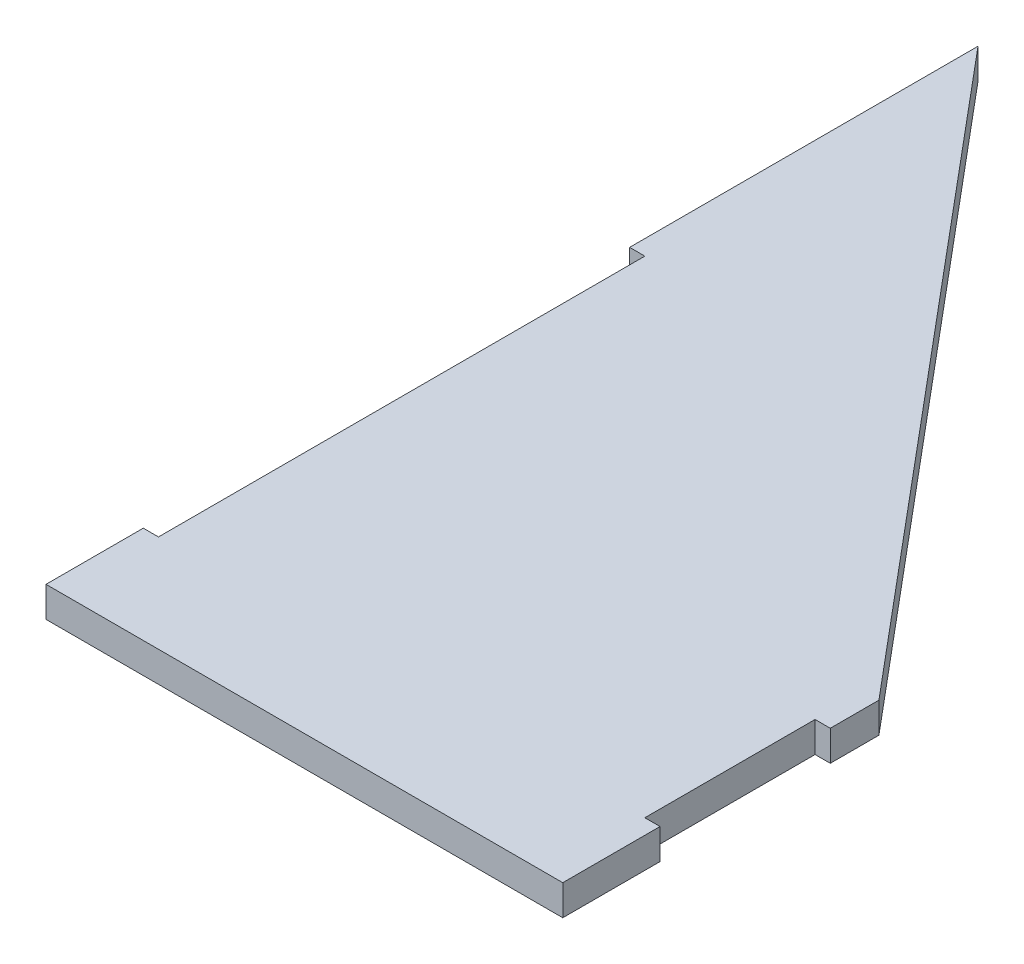
ISO-10303-21;
HEADER;
FILE_DESCRIPTION(('STEP AP214'),'2;1');
FILE_NAME('part.step','',(''),(''),'','','');
FILE_SCHEMA(('AUTOMOTIVE_DESIGN { 1 0 10303 214 1 1 1 1 }'));
ENDSEC;
DATA;
#1=APPLICATION_CONTEXT('core data for automotive mechanical design processes');
#2=APPLICATION_PROTOCOL_DEFINITION('international standard','automotive_design',2000,#1);
#3=PRODUCT_CONTEXT('',#1,'mechanical');
#4=PRODUCT('Part','Part','',(#3));
#5=PRODUCT_RELATED_PRODUCT_CATEGORY('part','',(#4));
#6=PRODUCT_DEFINITION_FORMATION('','',#4);
#7=PRODUCT_DEFINITION_CONTEXT('part definition',#1,'design');
#8=PRODUCT_DEFINITION('design','',#6,#7);
#9=PRODUCT_DEFINITION_SHAPE('','',#8);
#10=(LENGTH_UNIT() NAMED_UNIT(*) SI_UNIT(.MILLI.,.METRE.));
#11=(NAMED_UNIT(*) PLANE_ANGLE_UNIT() SI_UNIT($,.RADIAN.));
#12=(NAMED_UNIT(*) SI_UNIT($,.STERADIAN.) SOLID_ANGLE_UNIT());
#13=UNCERTAINTY_MEASURE_WITH_UNIT(LENGTH_MEASURE(1.E-05),#10,'distance_accuracy_value','');
#14=(GEOMETRIC_REPRESENTATION_CONTEXT(3) GLOBAL_UNCERTAINTY_ASSIGNED_CONTEXT((#13)) GLOBAL_UNIT_ASSIGNED_CONTEXT((#10,
#11,#12)) REPRESENTATION_CONTEXT('',''));
#15=CARTESIAN_POINT('',(0.,0.,0.));
#16=DIRECTION('',(0.,0.,1.));
#17=DIRECTION('',(1.,0.,0.));
#18=AXIS2_PLACEMENT_3D('',#15,#16,#17);
#19=CARTESIAN_POINT('',(0.,1.5875,-5.715));
#20=DIRECTION('',(0.,0.,1.));
#21=DIRECTION('',(1.,0.,0.));
#22=AXIS2_PLACEMENT_3D('',#19,#20,#21);
#23=PLANE('',#22);
#24=DIRECTION('',(-1.,0.,0.));
#25=VECTOR('',#24,1.);
#26=CARTESIAN_POINT('',(0.,0.,-5.715));
#27=LINE('',#26,#25);
#28=CARTESIAN_POINT('',(13.49375,0.,-5.715));
#29=VERTEX_POINT('',#28);
#30=CARTESIAN_POINT('',(12.7,0.,-5.715));
#31=VERTEX_POINT('',#30);
#32=EDGE_CURVE('E160',#29,#31,#27,.T.);
#33=ORIENTED_EDGE('',*,*,#32,.F.);
#34=DIRECTION('',(0.,-1.,0.));
#35=VECTOR('',#34,1.);
#36=CARTESIAN_POINT('',(13.49375,1.5875,-5.715));
#37=LINE('',#36,#35);
#38=CARTESIAN_POINT('',(13.49375,1.5875,-5.715));
#39=VERTEX_POINT('',#38);
#40=EDGE_CURVE('E11',#39,#29,#37,.T.);
#41=ORIENTED_EDGE('',*,*,#40,.F.);
#42=DIRECTION('',(-1.,0.,0.));
#43=VECTOR('',#42,1.);
#44=CARTESIAN_POINT('',(0.,1.5875,-5.715));
#45=LINE('',#44,#43);
#46=CARTESIAN_POINT('',(12.7,1.5875,-5.715));
#47=VERTEX_POINT('',#46);
#48=EDGE_CURVE('E189',#39,#47,#45,.T.);
#49=ORIENTED_EDGE('',*,*,#48,.T.);
#50=DIRECTION('',(0.,-1.,0.));
#51=VECTOR('',#50,1.);
#52=CARTESIAN_POINT('',(12.7,1.5875,-5.715));
#53=LINE('',#52,#51);
#54=EDGE_CURVE('E103',#47,#31,#53,.T.);
#55=ORIENTED_EDGE('',*,*,#54,.T.);
#56=EDGE_LOOP('',(#33,#41,#49,#55));
#57=FACE_BOUND('',#56,.T.);
#58=ADVANCED_FACE('F40',(#57),#23,.T.);
#59=CARTESIAN_POINT('',(13.49375,1.5875,0.));
#60=DIRECTION('',(-1.,0.,0.));
#61=DIRECTION('',(0.,0.,1.));
#62=AXIS2_PLACEMENT_3D('',#59,#60,#61);
#63=PLANE('',#62);
#64=DIRECTION('',(0.,0.,-1.));
#65=VECTOR('',#64,1.);
#66=CARTESIAN_POINT('',(13.49375,0.,0.));
#67=LINE('',#66,#65);
#68=CARTESIAN_POINT('',(13.49375,0.,-8.255));
#69=VERTEX_POINT('',#68);
#70=EDGE_CURVE('E163',#29,#69,#67,.T.);
#71=ORIENTED_EDGE('',*,*,#70,.T.);
#72=DIRECTION('',(0.,-1.,0.));
#73=VECTOR('',#72,1.);
#74=CARTESIAN_POINT('',(13.49375,1.5875,-8.255));
#75=LINE('',#74,#73);
#76=CARTESIAN_POINT('',(13.49375,1.5875,-8.255));
#77=VERTEX_POINT('',#76);
#78=EDGE_CURVE('E48',#77,#69,#75,.T.);
#79=ORIENTED_EDGE('',*,*,#78,.F.);
#80=DIRECTION('',(0.,0.,-1.));
#81=VECTOR('',#80,1.);
#82=CARTESIAN_POINT('',(13.49375,1.5875,0.));
#83=LINE('',#82,#81);
#84=EDGE_CURVE('E146',#39,#77,#83,.T.);
#85=ORIENTED_EDGE('',*,*,#84,.F.);
#86=ORIENTED_EDGE('',*,*,#40,.T.);
#87=EDGE_LOOP('',(#71,#79,#85,#86));
#88=FACE_BOUND('',#87,.T.);
#89=ADVANCED_FACE('F213',(#88),#63,.F.);
#90=CARTESIAN_POINT('',(11.9832515492545,1.5875,-10.055141955284));
#91=DIRECTION('',(0.766044443118979,0.,-0.642787609686538));
#92=DIRECTION('',(-0.642787609686538,0.,-0.766044443118979));
#93=AXIS2_PLACEMENT_3D('',#90,#91,#92);
#94=PLANE('',#93);
#95=DIRECTION('',(0.642787609686538,0.,0.766044443118979));
#96=VECTOR('',#95,1.);
#97=CARTESIAN_POINT('',(11.9832515492545,0.,-10.055141955284));
#98=LINE('',#97,#96);
#99=CARTESIAN_POINT('',(-13.49375,0.,-40.4174500801364));
#100=VERTEX_POINT('',#99);
#101=EDGE_CURVE('E166',#100,#69,#98,.T.);
#102=ORIENTED_EDGE('',*,*,#101,.F.);
#103=DIRECTION('',(0.,-1.,0.));
#104=VECTOR('',#103,1.);
#105=CARTESIAN_POINT('',(-13.49375,1.5875,-40.4174500801364));
#106=LINE('',#105,#104);
#107=CARTESIAN_POINT('',(-13.49375,1.5875,-40.4174500801364));
#108=VERTEX_POINT('',#107);
#109=EDGE_CURVE('E203',#108,#100,#106,.T.);
#110=ORIENTED_EDGE('',*,*,#109,.F.);
#111=DIRECTION('',(0.642787609686538,0.,0.766044443118979));
#112=VECTOR('',#111,1.);
#113=CARTESIAN_POINT('',(11.9832515492545,1.5875,-10.055141955284));
#114=LINE('',#113,#112);
#115=EDGE_CURVE('E210',#108,#77,#114,.T.);
#116=ORIENTED_EDGE('',*,*,#115,.T.);
#117=ORIENTED_EDGE('',*,*,#78,.T.);
#118=EDGE_LOOP('',(#102,#110,#116,#117));
#119=FACE_BOUND('',#118,.T.);
#120=ADVANCED_FACE('F208',(#119),#94,.T.);
#121=CARTESIAN_POINT('',(-13.49375,1.5875,0.));
#122=DIRECTION('',(-1.,0.,0.));
#123=DIRECTION('',(0.,0.,1.));
#124=AXIS2_PLACEMENT_3D('',#121,#122,#123);
#125=PLANE('',#124);
#126=DIRECTION('',(0.,0.,-1.));
#127=VECTOR('',#126,1.);
#128=CARTESIAN_POINT('',(-13.49375,0.,0.));
#129=LINE('',#128,#127);
#130=CARTESIAN_POINT('',(-13.49375,0.,-22.225));
#131=VERTEX_POINT('',#130);
#132=EDGE_CURVE('E169',#131,#100,#129,.T.);
#133=ORIENTED_EDGE('',*,*,#132,.F.);
#134=DIRECTION('',(0.,-1.,0.));
#135=VECTOR('',#134,1.);
#136=CARTESIAN_POINT('',(-13.49375,1.5875,-22.225));
#137=LINE('',#136,#135);
#138=CARTESIAN_POINT('',(-13.49375,1.5875,-22.225));
#139=VERTEX_POINT('',#138);
#140=EDGE_CURVE('E201',#139,#131,#137,.T.);
#141=ORIENTED_EDGE('',*,*,#140,.F.);
#142=DIRECTION('',(0.,0.,-1.));
#143=VECTOR('',#142,1.);
#144=CARTESIAN_POINT('',(-13.49375,1.5875,0.));
#145=LINE('',#144,#143);
#146=EDGE_CURVE('E223',#139,#108,#145,.T.);
#147=ORIENTED_EDGE('',*,*,#146,.T.);
#148=ORIENTED_EDGE('',*,*,#109,.T.);
#149=EDGE_LOOP('',(#133,#141,#147,#148));
#150=FACE_BOUND('',#149,.T.);
#151=ADVANCED_FACE('F219',(#150),#125,.T.);
#152=CARTESIAN_POINT('',(0.,1.5875,-22.225));
#153=DIRECTION('',(0.,0.,-1.));
#154=DIRECTION('',(-1.,0.,0.));
#155=AXIS2_PLACEMENT_3D('',#152,#153,#154);
#156=PLANE('',#155);
#157=DIRECTION('',(1.,0.,0.));
#158=VECTOR('',#157,1.);
#159=CARTESIAN_POINT('',(0.,0.,-22.225));
#160=LINE('',#159,#158);
#161=CARTESIAN_POINT('',(-12.7,0.,-22.225));
#162=VERTEX_POINT('',#161);
#163=EDGE_CURVE('E172',#131,#162,#160,.T.);
#164=ORIENTED_EDGE('',*,*,#163,.T.);
#165=DIRECTION('',(0.,-1.,0.));
#166=VECTOR('',#165,1.);
#167=CARTESIAN_POINT('',(-12.7,1.5875,-22.225));
#168=LINE('',#167,#166);
#169=CARTESIAN_POINT('',(-12.7,1.5875,-22.225));
#170=VERTEX_POINT('',#169);
#171=EDGE_CURVE('E199',#170,#162,#168,.T.);
#172=ORIENTED_EDGE('',*,*,#171,.F.);
#173=DIRECTION('',(1.,0.,0.));
#174=VECTOR('',#173,1.);
#175=CARTESIAN_POINT('',(0.,1.5875,-22.225));
#176=LINE('',#175,#174);
#177=EDGE_CURVE('E225',#139,#170,#176,.T.);
#178=ORIENTED_EDGE('',*,*,#177,.F.);
#179=ORIENTED_EDGE('',*,*,#140,.T.);
#180=EDGE_LOOP('',(#164,#172,#178,#179));
#181=FACE_BOUND('',#180,.T.);
#182=ADVANCED_FACE('F326',(#181),#156,.F.);
#183=CARTESIAN_POINT('',(-12.7,1.5875,0.));
#184=DIRECTION('',(-1.,0.,0.));
#185=DIRECTION('',(0.,0.,1.));
#186=AXIS2_PLACEMENT_3D('',#183,#184,#185);
#187=PLANE('',#186);
#188=DIRECTION('',(0.,0.,-1.));
#189=VECTOR('',#188,1.);
#190=CARTESIAN_POINT('',(-12.7,0.,0.));
#191=LINE('',#190,#189);
#192=CARTESIAN_POINT('',(-12.7,0.,3.175));
#193=VERTEX_POINT('',#192);
#194=EDGE_CURVE('E175',#193,#162,#191,.T.);
#195=ORIENTED_EDGE('',*,*,#194,.F.);
#196=DIRECTION('',(0.,-1.,0.));
#197=VECTOR('',#196,1.);
#198=CARTESIAN_POINT('',(-12.7,1.5875,3.175));
#199=LINE('',#198,#197);
#200=CARTESIAN_POINT('',(-12.7,1.5875,3.175));
#201=VERTEX_POINT('',#200);
#202=EDGE_CURVE('E197',#201,#193,#199,.T.);
#203=ORIENTED_EDGE('',*,*,#202,.F.);
#204=DIRECTION('',(0.,0.,-1.));
#205=VECTOR('',#204,1.);
#206=CARTESIAN_POINT('',(-12.7,1.5875,0.));
#207=LINE('',#206,#205);
#208=EDGE_CURVE('E230',#201,#170,#207,.T.);
#209=ORIENTED_EDGE('',*,*,#208,.T.);
#210=ORIENTED_EDGE('',*,*,#171,.T.);
#211=EDGE_LOOP('',(#195,#203,#209,#210));
#212=FACE_BOUND('',#211,.T.);
#213=ADVANCED_FACE('F317',(#212),#187,.T.);
#214=CARTESIAN_POINT('',(0.,1.5875,3.175));
#215=DIRECTION('',(0.,0.,-1.));
#216=DIRECTION('',(-1.,0.,0.));
#217=AXIS2_PLACEMENT_3D('',#214,#215,#216);
#218=PLANE('',#217);
#219=DIRECTION('',(1.,0.,0.));
#220=VECTOR('',#219,1.);
#221=CARTESIAN_POINT('',(0.,0.,3.175));
#222=LINE('',#221,#220);
#223=CARTESIAN_POINT('',(-13.49375,0.,3.175));
#224=VERTEX_POINT('',#223);
#225=EDGE_CURVE('E178',#224,#193,#222,.T.);
#226=ORIENTED_EDGE('',*,*,#225,.F.);
#227=DIRECTION('',(0.,-1.,0.));
#228=VECTOR('',#227,1.);
#229=CARTESIAN_POINT('',(-13.49375,1.5875,3.175));
#230=LINE('',#229,#228);
#231=CARTESIAN_POINT('',(-13.49375,1.5875,3.175));
#232=VERTEX_POINT('',#231);
#233=EDGE_CURVE('E195',#232,#224,#230,.T.);
#234=ORIENTED_EDGE('',*,*,#233,.F.);
#235=DIRECTION('',(1.,0.,0.));
#236=VECTOR('',#235,1.);
#237=CARTESIAN_POINT('',(0.,1.5875,3.175));
#238=LINE('',#237,#236);
#239=EDGE_CURVE('E233',#232,#201,#238,.T.);
#240=ORIENTED_EDGE('',*,*,#239,.T.);
#241=ORIENTED_EDGE('',*,*,#202,.T.);
#242=EDGE_LOOP('',(#226,#234,#240,#241));
#243=FACE_BOUND('',#242,.T.);
#244=ADVANCED_FACE('F244',(#243),#218,.T.);
#245=CARTESIAN_POINT('',(-13.49375,1.5875,0.));
#246=DIRECTION('',(-1.,0.,0.));
#247=DIRECTION('',(0.,0.,1.));
#248=AXIS2_PLACEMENT_3D('',#245,#246,#247);
#249=PLANE('',#248);
#250=DIRECTION('',(0.,0.,-1.));
#251=VECTOR('',#250,1.);
#252=CARTESIAN_POINT('',(-13.49375,0.,0.));
#253=LINE('',#252,#251);
#254=CARTESIAN_POINT('',(-13.49375,0.,8.255));
#255=VERTEX_POINT('',#254);
#256=EDGE_CURVE('E181',#255,#224,#253,.T.);
#257=ORIENTED_EDGE('',*,*,#256,.F.);
#258=DIRECTION('',(0.,-1.,0.));
#259=VECTOR('',#258,1.);
#260=CARTESIAN_POINT('',(-13.49375,1.5875,8.255));
#261=LINE('',#260,#259);
#262=CARTESIAN_POINT('',(-13.49375,1.5875,8.255));
#263=VERTEX_POINT('',#262);
#264=EDGE_CURVE('E193',#263,#255,#261,.T.);
#265=ORIENTED_EDGE('',*,*,#264,.F.);
#266=DIRECTION('',(0.,0.,-1.));
#267=VECTOR('',#266,1.);
#268=CARTESIAN_POINT('',(-13.49375,1.5875,0.));
#269=LINE('',#268,#267);
#270=EDGE_CURVE('E235',#263,#232,#269,.T.);
#271=ORIENTED_EDGE('',*,*,#270,.T.);
#272=ORIENTED_EDGE('',*,*,#233,.T.);
#273=EDGE_LOOP('',(#257,#265,#271,#272));
#274=FACE_BOUND('',#273,.T.);
#275=ADVANCED_FACE('F239',(#274),#249,.T.);
#276=CARTESIAN_POINT('',(0.,1.5875,8.255));
#277=DIRECTION('',(0.,0.,-1.));
#278=DIRECTION('',(-1.,0.,0.));
#279=AXIS2_PLACEMENT_3D('',#276,#277,#278);
#280=PLANE('',#279);
#281=DIRECTION('',(1.,0.,0.));
#282=VECTOR('',#281,1.);
#283=CARTESIAN_POINT('',(0.,0.,8.255));
#284=LINE('',#283,#282);
#285=CARTESIAN_POINT('',(13.49375,0.,8.255));
#286=VERTEX_POINT('',#285);
#287=EDGE_CURVE('E184',#255,#286,#284,.T.);
#288=ORIENTED_EDGE('',*,*,#287,.T.);
#289=DIRECTION('',(0.,-1.,0.));
#290=VECTOR('',#289,1.);
#291=CARTESIAN_POINT('',(13.49375,1.5875,8.255));
#292=LINE('',#291,#290);
#293=CARTESIAN_POINT('',(13.49375,1.5875,8.255));
#294=VERTEX_POINT('',#293);
#295=EDGE_CURVE('E151',#294,#286,#292,.T.);
#296=ORIENTED_EDGE('',*,*,#295,.F.);
#297=DIRECTION('',(1.,0.,0.));
#298=VECTOR('',#297,1.);
#299=CARTESIAN_POINT('',(0.,1.5875,8.255));
#300=LINE('',#299,#298);
#301=EDGE_CURVE('E141',#263,#294,#300,.T.);
#302=ORIENTED_EDGE('',*,*,#301,.F.);
#303=ORIENTED_EDGE('',*,*,#264,.T.);
#304=EDGE_LOOP('',(#288,#296,#302,#303));
#305=FACE_BOUND('',#304,.T.);
#306=ADVANCED_FACE('F248',(#305),#280,.F.);
#307=CARTESIAN_POINT('',(13.49375,0.,3.175));
#308=VERTEX_POINT('',#307);
#309=EDGE_CURVE('E150',#286,#308,#67,.T.);
#310=ORIENTED_EDGE('',*,*,#309,.T.);
#311=DIRECTION('',(0.,-1.,0.));
#312=VECTOR('',#311,1.);
#313=CARTESIAN_POINT('',(13.49375,1.5875,3.175));
#314=LINE('',#313,#312);
#315=CARTESIAN_POINT('',(13.49375,1.5875,3.175));
#316=VERTEX_POINT('',#315);
#317=EDGE_CURVE('E147',#316,#308,#314,.T.);
#318=ORIENTED_EDGE('',*,*,#317,.F.);
#319=EDGE_CURVE('E134',#294,#316,#83,.T.);
#320=ORIENTED_EDGE('',*,*,#319,.F.);
#321=ORIENTED_EDGE('',*,*,#295,.T.);
#322=EDGE_LOOP('',(#310,#318,#320,#321));
#323=FACE_BOUND('',#322,.T.);
#324=ADVANCED_FACE('F148',(#323),#63,.F.);
#325=CARTESIAN_POINT('',(0.,1.5875,3.175));
#326=DIRECTION('',(0.,0.,1.));
#327=DIRECTION('',(1.,0.,0.));
#328=AXIS2_PLACEMENT_3D('',#325,#326,#327);
#329=PLANE('',#328);
#330=DIRECTION('',(-1.,0.,0.));
#331=VECTOR('',#330,1.);
#332=CARTESIAN_POINT('',(0.,0.,3.175));
#333=LINE('',#332,#331);
#334=CARTESIAN_POINT('',(12.7,0.,3.175));
#335=VERTEX_POINT('',#334);
#336=EDGE_CURVE('E96',#308,#335,#333,.T.);
#337=ORIENTED_EDGE('',*,*,#336,.T.);
#338=DIRECTION('',(0.,-1.,0.));
#339=VECTOR('',#338,1.);
#340=CARTESIAN_POINT('',(12.7,1.5875,3.175));
#341=LINE('',#340,#339);
#342=CARTESIAN_POINT('',(12.7,1.5875,3.175));
#343=VERTEX_POINT('',#342);
#344=EDGE_CURVE('E152',#343,#335,#341,.T.);
#345=ORIENTED_EDGE('',*,*,#344,.F.);
#346=DIRECTION('',(-1.,0.,0.));
#347=VECTOR('',#346,1.);
#348=CARTESIAN_POINT('',(0.,1.5875,3.175));
#349=LINE('',#348,#347);
#350=EDGE_CURVE('E138',#316,#343,#349,.T.);
#351=ORIENTED_EDGE('',*,*,#350,.F.);
#352=ORIENTED_EDGE('',*,*,#317,.T.);
#353=EDGE_LOOP('',(#337,#345,#351,#352));
#354=FACE_BOUND('',#353,.T.);
#355=ADVANCED_FACE('F154',(#354),#329,.F.);
#356=CARTESIAN_POINT('',(12.7,1.5875,0.));
#357=DIRECTION('',(-1.,0.,0.));
#358=DIRECTION('',(0.,0.,1.));
#359=AXIS2_PLACEMENT_3D('',#356,#357,#358);
#360=PLANE('',#359);
#361=DIRECTION('',(0.,0.,-1.));
#362=VECTOR('',#361,1.);
#363=CARTESIAN_POINT('',(12.7,0.,0.));
#364=LINE('',#363,#362);
#365=EDGE_CURVE('E187',#335,#31,#364,.T.);
#366=ORIENTED_EDGE('',*,*,#365,.T.);
#367=ORIENTED_EDGE('',*,*,#54,.F.);
#368=DIRECTION('',(0.,0.,-1.));
#369=VECTOR('',#368,1.);
#370=CARTESIAN_POINT('',(12.7,1.5875,0.));
#371=LINE('',#370,#369);
#372=EDGE_CURVE('E56',#343,#47,#371,.T.);
#373=ORIENTED_EDGE('',*,*,#372,.F.);
#374=ORIENTED_EDGE('',*,*,#344,.T.);
#375=EDGE_LOOP('',(#366,#367,#373,#374));
#376=FACE_BOUND('',#375,.T.);
#377=ADVANCED_FACE('F263',(#376),#360,.F.);
#378=CARTESIAN_POINT('',(0.,1.5875,0.));
#379=DIRECTION('',(0.,1.,0.));
#380=DIRECTION('',(0.,0.,1.));
#381=AXIS2_PLACEMENT_3D('',#378,#379,#380);
#382=PLANE('',#381);
#383=ORIENTED_EDGE('',*,*,#48,.F.);
#384=ORIENTED_EDGE('',*,*,#84,.T.);
#385=ORIENTED_EDGE('',*,*,#115,.F.);
#386=ORIENTED_EDGE('',*,*,#146,.F.);
#387=ORIENTED_EDGE('',*,*,#177,.T.);
#388=ORIENTED_EDGE('',*,*,#208,.F.);
#389=ORIENTED_EDGE('',*,*,#239,.F.);
#390=ORIENTED_EDGE('',*,*,#270,.F.);
#391=ORIENTED_EDGE('',*,*,#301,.T.);
#392=ORIENTED_EDGE('',*,*,#319,.T.);
#393=ORIENTED_EDGE('',*,*,#350,.T.);
#394=ORIENTED_EDGE('',*,*,#372,.T.);
#395=EDGE_LOOP('',(#383,#384,#385,#386,#387,#388,#389,#390,#391,#392,#393,#394));
#396=FACE_BOUND('',#395,.T.);
#397=ADVANCED_FACE('F136',(#396),#382,.T.);
#398=CARTESIAN_POINT('',(0.,0.,0.));
#399=DIRECTION('',(0.,1.,0.));
#400=DIRECTION('',(0.,0.,1.));
#401=AXIS2_PLACEMENT_3D('',#398,#399,#400);
#402=PLANE('',#401);
#403=ORIENTED_EDGE('',*,*,#32,.T.);
#404=ORIENTED_EDGE('',*,*,#365,.F.);
#405=ORIENTED_EDGE('',*,*,#336,.F.);
#406=ORIENTED_EDGE('',*,*,#309,.F.);
#407=ORIENTED_EDGE('',*,*,#287,.F.);
#408=ORIENTED_EDGE('',*,*,#256,.T.);
#409=ORIENTED_EDGE('',*,*,#225,.T.);
#410=ORIENTED_EDGE('',*,*,#194,.T.);
#411=ORIENTED_EDGE('',*,*,#163,.F.);
#412=ORIENTED_EDGE('',*,*,#132,.T.);
#413=ORIENTED_EDGE('',*,*,#101,.T.);
#414=ORIENTED_EDGE('',*,*,#70,.F.);
#415=EDGE_LOOP('',(#403,#404,#405,#406,#407,#408,#409,#410,#411,#412,#413,#414));
#416=FACE_BOUND('',#415,.T.);
#417=ADVANCED_FACE('F215',(#416),#402,.F.);
#418=CLOSED_SHELL('',(#58,#89,#120,#151,#182,#213,#244,#275,#306,#324,#355,#377,#397,#417));
#419=MANIFOLD_SOLID_BREP('B2',#418);
#420=ADVANCED_BREP_SHAPE_REPRESENTATION('',(#18,#419),#14);
#421=SHAPE_DEFINITION_REPRESENTATION(#9,#420);
ENDSEC;
END-ISO-10303-21;
